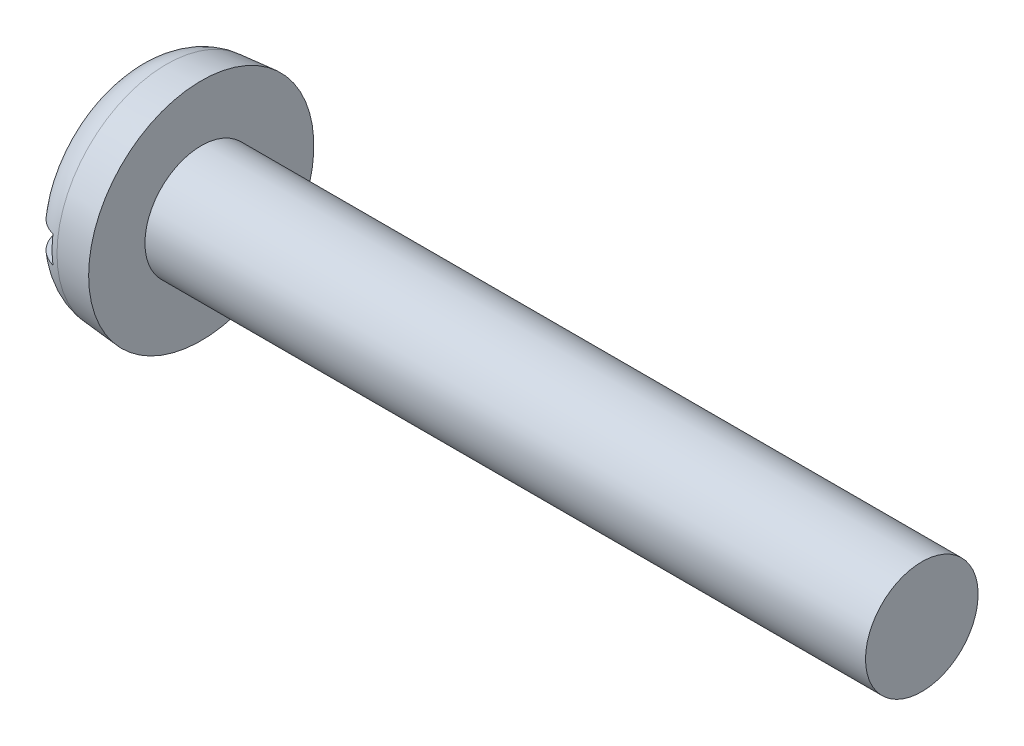
ISO-10303-21;
HEADER;
FILE_DESCRIPTION(('STEP AP214'),'2;1');
FILE_NAME('part.step','',(''),(''),'','','');
FILE_SCHEMA(('AUTOMOTIVE_DESIGN { 1 0 10303 214 1 1 1 1 }'));
ENDSEC;
DATA;
#1=APPLICATION_CONTEXT('core data for automotive mechanical design processes');
#2=APPLICATION_PROTOCOL_DEFINITION('international standard','automotive_design',2000,#1);
#3=PRODUCT_CONTEXT('',#1,'mechanical');
#4=PRODUCT('Part','Part','',(#3));
#5=PRODUCT_RELATED_PRODUCT_CATEGORY('part','',(#4));
#6=PRODUCT_DEFINITION_FORMATION('','',#4);
#7=PRODUCT_DEFINITION_CONTEXT('part definition',#1,'design');
#8=PRODUCT_DEFINITION('design','',#6,#7);
#9=PRODUCT_DEFINITION_SHAPE('','',#8);
#10=(LENGTH_UNIT() NAMED_UNIT(*) SI_UNIT(.MILLI.,.METRE.));
#11=(NAMED_UNIT(*) PLANE_ANGLE_UNIT() SI_UNIT($,.RADIAN.));
#12=(NAMED_UNIT(*) SI_UNIT($,.STERADIAN.) SOLID_ANGLE_UNIT());
#13=UNCERTAINTY_MEASURE_WITH_UNIT(LENGTH_MEASURE(1.E-05),#10,'distance_accuracy_value','');
#14=(GEOMETRIC_REPRESENTATION_CONTEXT(3) GLOBAL_UNCERTAINTY_ASSIGNED_CONTEXT((#13)) GLOBAL_UNIT_ASSIGNED_CONTEXT((#10,
#11,#12)) REPRESENTATION_CONTEXT('',''));
#15=CARTESIAN_POINT('',(0.,0.,0.));
#16=DIRECTION('',(0.,0.,1.));
#17=DIRECTION('',(1.,0.,0.));
#18=AXIS2_PLACEMENT_3D('',#15,#16,#17);
#19=CARTESIAN_POINT('',(0.,0.,0.));
#20=DIRECTION('',(-1.,0.,0.));
#21=DIRECTION('',(0.,0.,1.));
#22=AXIS2_PLACEMENT_3D('',#19,#20,#21);
#23=PLANE('',#22);
#24=DIRECTION('',(0.,0.,-1.));
#25=VECTOR('',#24,1.);
#26=CARTESIAN_POINT('',(0.,0.3,2.5));
#27=LINE('',#26,#25);
#28=CARTESIAN_POINT('',(0.,0.3,1.60795561103898));
#29=VERTEX_POINT('',#28);
#30=CARTESIAN_POINT('',(0.,0.3,-1.60795561103898));
#31=VERTEX_POINT('',#30);
#32=EDGE_CURVE('E92',#29,#31,#27,.T.);
#33=ORIENTED_EDGE('',*,*,#32,.F.);
#34=CARTESIAN_POINT('',(0.,0.,0.));
#35=DIRECTION('',(-1.,0.,0.));
#36=DIRECTION('',(0.,0.,1.));
#37=AXIS2_PLACEMENT_3D('',#34,#35,#36);
#38=CIRCLE('',#37,1.63570206549718);
#39=EDGE_CURVE('E97',#29,#31,#38,.T.);
#40=ORIENTED_EDGE('',*,*,#39,.T.);
#41=EDGE_LOOP('',(#33,#40));
#42=FACE_BOUND('',#41,.T.);
#43=ADVANCED_FACE('F35',(#42),#23,.T.);
#44=CARTESIAN_POINT('',(-25.4,0.,0.));
#45=DIRECTION('',(-1.,0.,0.));
#46=DIRECTION('',(0.,0.,1.));
#47=AXIS2_PLACEMENT_3D('',#44,#45,#46);
#48=CYLINDRICAL_SURFACE('',#47,1.25);
#49=CARTESIAN_POINT('',(17.5,0.,0.));
#50=DIRECTION('',(-1.,0.,0.));
#51=DIRECTION('',(0.,0.,1.));
#52=AXIS2_PLACEMENT_3D('',#49,#50,#51);
#53=CIRCLE('',#52,1.25);
#54=CARTESIAN_POINT('',(17.5,0.,1.25));
#55=VERTEX_POINT('',#54);
#56=EDGE_CURVE('E98',#55,#55,#53,.T.);
#57=ORIENTED_EDGE('',*,*,#56,.T.);
#58=EDGE_LOOP('',(#57));
#59=FACE_BOUND('',#58,.T.);
#60=CARTESIAN_POINT('',(1.5,0.,0.));
#61=DIRECTION('',(-1.,0.,0.));
#62=DIRECTION('',(0.,0.,1.));
#63=AXIS2_PLACEMENT_3D('',#60,#61,#62);
#64=CIRCLE('',#63,1.25);
#65=CARTESIAN_POINT('',(1.5,0.,1.25));
#66=VERTEX_POINT('',#65);
#67=EDGE_CURVE('E130',#66,#66,#64,.T.);
#68=ORIENTED_EDGE('',*,*,#67,.F.);
#69=EDGE_LOOP('',(#68));
#70=FACE_BOUND('',#69,.T.);
#71=ADVANCED_FACE('F147',(#59,#70),#48,.T.);
#72=CARTESIAN_POINT('',(17.5,1.25,0.));
#73=DIRECTION('',(1.,0.,0.));
#74=DIRECTION('',(0.,0.,-1.));
#75=AXIS2_PLACEMENT_3D('',#72,#73,#74);
#76=PLANE('',#75);
#77=ORIENTED_EDGE('',*,*,#56,.F.);
#78=EDGE_LOOP('',(#77));
#79=FACE_BOUND('',#78,.T.);
#80=ADVANCED_FACE('F149',(#79),#76,.T.);
#81=DIRECTION('',(0.,0.,1.));
#82=VECTOR('',#81,1.);
#83=CARTESIAN_POINT('',(0.,-0.3,-2.5));
#84=LINE('',#83,#82);
#85=CARTESIAN_POINT('',(0.,-0.3,-1.60795561103898));
#86=VERTEX_POINT('',#85);
#87=CARTESIAN_POINT('',(0.,-0.3,1.60795561103898));
#88=VERTEX_POINT('',#87);
#89=EDGE_CURVE('E80',#86,#88,#84,.T.);
#90=ORIENTED_EDGE('',*,*,#89,.F.);
#91=EDGE_CURVE('E91',#86,#88,#38,.T.);
#92=ORIENTED_EDGE('',*,*,#91,.T.);
#93=EDGE_LOOP('',(#90,#92));
#94=FACE_BOUND('',#93,.T.);
#95=ADVANCED_FACE('F90',(#94),#23,.T.);
#96=CARTESIAN_POINT('',(0.,0.,0.));
#97=DIRECTION('',(1.,0.,0.));
#98=DIRECTION('',(0.,0.,-1.));
#99=AXIS2_PLACEMENT_3D('',#96,#97,#98);
#100=CONICAL_SURFACE('',#99,2.36876700471111,0.0872664625997166);
#101=CARTESIAN_POINT('',(0.730275405801877,0.,0.));
#102=DIRECTION('',(-1.,0.,0.));
#103=DIRECTION('',(0.,0.,1.));
#104=AXIS2_PLACEMENT_3D('',#101,#102,#103);
#105=CIRCLE('',#104,2.43265782397057);
#106=CARTESIAN_POINT('',(0.730275405801877,0.,2.43265782397057));
#107=VERTEX_POINT('',#106);
#108=EDGE_CURVE('E101',#107,#107,#105,.F.);
#109=ORIENTED_EDGE('',*,*,#108,.T.);
#110=EDGE_LOOP('',(#109));
#111=FACE_BOUND('',#110,.T.);
#112=CARTESIAN_POINT('',(1.5,0.,0.));
#113=DIRECTION('',(-1.,0.,0.));
#114=DIRECTION('',(0.,0.,1.));
#115=AXIS2_PLACEMENT_3D('',#112,#113,#114);
#116=CIRCLE('',#115,2.5);
#117=CARTESIAN_POINT('',(1.5,0.,2.5));
#118=VERTEX_POINT('',#117);
#119=EDGE_CURVE('E103',#118,#118,#116,.T.);
#120=ORIENTED_EDGE('',*,*,#119,.T.);
#121=EDGE_LOOP('',(#120));
#122=FACE_BOUND('',#121,.T.);
#123=ADVANCED_FACE('F140',(#111,#122),#100,.T.);
#124=CARTESIAN_POINT('',(1.5,1.25,0.));
#125=DIRECTION('',(-1.,0.,0.));
#126=DIRECTION('',(0.,0.,1.));
#127=AXIS2_PLACEMENT_3D('',#124,#125,#126);
#128=PLANE('',#127);
#129=ORIENTED_EDGE('',*,*,#119,.F.);
#130=EDGE_LOOP('',(#129));
#131=FACE_BOUND('',#130,.T.);
#132=ORIENTED_EDGE('',*,*,#67,.T.);
#133=EDGE_LOOP('',(#132));
#134=FACE_BOUND('',#133,.T.);
#135=ADVANCED_FACE('F142',(#131,#134),#128,.F.);
#136=CARTESIAN_POINT('',(0.8,0.,0.));
#137=DIRECTION('',(-1.,0.,0.));
#138=DIRECTION('',(0.,0.,1.));
#139=AXIS2_PLACEMENT_3D('',#136,#137,#138);
#140=TOROIDAL_SURFACE('',#139,1.63570206549718,0.8);
#141=CARTESIAN_POINT('',(0.325582780276124,0.3,0.945080375473809));
#142=CARTESIAN_POINT('',(0.360465980063241,0.3,0.918126802110936));
#143=CARTESIAN_POINT('',(0.39753706526557,0.3,0.893967942779769));
#144=CARTESIAN_POINT('',(0.475178290688802,0.3,0.852069987659488));
#145=CARTESIAN_POINT('',(0.515750532052562,0.3,0.834334780531919));
#146=CARTESIAN_POINT('',(0.599430848847029,0.3,0.806000384113138));
#147=CARTESIAN_POINT('',(0.642544269111198,0.3,0.795416864771676));
#148=CARTESIAN_POINT('',(0.729949162731264,0.3,0.781986474876278));
#149=CARTESIAN_POINT('',(0.774240066404735,0.3,0.779135929395147));
#150=CARTESIAN_POINT('',(0.860900121676645,0.3,0.781273956549656));
#151=CARTESIAN_POINT('',(0.903277030490993,0.3,0.78596201346097));
#152=CARTESIAN_POINT('',(0.986642370355979,0.3,0.802380024886476));
#153=CARTESIAN_POINT('',(1.02763059365552,0.3,0.814111028173032));
#154=CARTESIAN_POINT('',(1.10721823284323,0.3,0.844123858953993));
#155=CARTESIAN_POINT('',(1.1458124991436,0.3,0.862419270395216));
#156=CARTESIAN_POINT('',(1.21961995450231,0.3,0.904880158503461));
#157=CARTESIAN_POINT('',(1.25483237249778,0.3,0.929046969439742));
#158=CARTESIAN_POINT('',(1.32303560057829,0.3,0.984072001853194));
#159=CARTESIAN_POINT('',(1.35577888139986,0.3,1.01523716445421));
#160=CARTESIAN_POINT('',(1.41584692891579,0.3,1.08241378648038));
#161=CARTESIAN_POINT('',(1.44317052446759,0.3,1.11842629055405));
#162=CARTESIAN_POINT('',(1.49280325678613,0.3,1.19602852166851));
#163=CARTESIAN_POINT('',(1.51483781340697,0.3,1.23779426477491));
#164=CARTESIAN_POINT('',(1.55163905141108,0.3,1.32441622243948));
#165=CARTESIAN_POINT('',(1.56640526316449,0.3,1.36927263648188));
#166=CARTESIAN_POINT('',(1.58827918347229,0.3,1.46113964054829));
#167=CARTESIAN_POINT('',(1.59533472667039,0.3,1.50816268758402));
#168=CARTESIAN_POINT('',(1.6013346905055,0.3,1.60272526959095));
#169=CARTESIAN_POINT('',(1.60027956409726,0.3,1.65026477557152));
#170=CARTESIAN_POINT('',(1.59008797685701,0.3,1.74381783348114));
#171=CARTESIAN_POINT('',(1.58106139766669,0.3,1.78984333913577));
#172=CARTESIAN_POINT('',(1.55527524427561,0.3,1.87967577306516));
#173=CARTESIAN_POINT('',(1.53851634881931,0.3,1.92348289569559));
#174=CARTESIAN_POINT('',(1.49805220541173,0.3,2.00685269808732));
#175=CARTESIAN_POINT('',(1.47446834364961,0.3,2.04647430465032));
#176=CARTESIAN_POINT('',(1.42089792894649,0.3,2.1211234970726));
#177=CARTESIAN_POINT('',(1.3909118606683,0.3,2.15615143036044));
#178=CARTESIAN_POINT('',(1.32582862648853,0.3,2.2201279422891));
#179=CARTESIAN_POINT('',(1.29080536334854,0.3,2.24915172052564));
#180=CARTESIAN_POINT('',(1.21634648807777,0.3,2.30084404424662));
#181=CARTESIAN_POINT('',(1.17691110751969,0.3,2.32351292305314));
#182=CARTESIAN_POINT('',(1.09512866163486,0.3,2.36164850031485));
#183=CARTESIAN_POINT('',(1.05281068319476,0.3,2.3771775951495));
#184=CARTESIAN_POINT('',(0.966161216102551,0.3,2.40087211912405));
#185=CARTESIAN_POINT('',(0.921829790458232,0.3,2.40903777852502));
#186=CARTESIAN_POINT('',(0.832640430359507,0.3,2.41774335624929));
#187=CARTESIAN_POINT('',(0.7877860528966,0.3,2.41831975618198));
#188=CARTESIAN_POINT('',(0.698619111765284,0.3,2.41192430101879));
#189=CARTESIAN_POINT('',(0.654306541311374,0.3,2.40495254055294));
#190=CARTESIAN_POINT('',(0.567532539437919,0.3,2.38367749197694));
#191=CARTESIAN_POINT('',(0.52506904210772,0.3,2.36938262630023));
#192=CARTESIAN_POINT('',(0.443136883800956,0.3,2.33388299490975));
#193=CARTESIAN_POINT('',(0.403668232188874,0.3,2.31267820759068));
#194=CARTESIAN_POINT('',(0.328740033099907,0.3,2.26391578070522));
#195=CARTESIAN_POINT('',(0.293290208870805,0.3,2.2363432040147));
#196=CARTESIAN_POINT('',(0.227488732055977,0.3,2.17567064913893));
#197=CARTESIAN_POINT('',(0.197137190224435,0.3,2.14257055090592));
#198=CARTESIAN_POINT('',(0.142187319315971,0.3,2.07157434399725));
#199=CARTESIAN_POINT('',(0.117625116072336,0.3,2.03365028172316));
#200=CARTESIAN_POINT('',(0.0751433334566951,0.3,1.95424980482485));
#201=CARTESIAN_POINT('',(0.0572240456172602,0.3,1.91277323439274));
#202=CARTESIAN_POINT('',(0.0283296075078316,0.3,1.82699572686938));
#203=CARTESIAN_POINT('',(0.0174274062366743,0.3,1.78267022764793));
#204=CARTESIAN_POINT('',(0.00310551600841476,0.3,1.69282988983353));
#205=CARTESIAN_POINT('',(-0.000313975803850485,0.3,1.64731501993655));
#206=CARTESIAN_POINT('',(0.000364158464117038,0.3,1.55568808107934));
#207=CARTESIAN_POINT('',(0.00457053083061458,0.3,1.50957683083959));
#208=CARTESIAN_POINT('',(0.020533993522222,0.3,1.41866966757813));
#209=CARTESIAN_POINT('',(0.0322934645206838,0.3,1.37387417392873));
#210=CARTESIAN_POINT('',(0.0632540980285071,0.3,1.2860673502027));
#211=CARTESIAN_POINT('',(0.082579900046769,0.3,1.24310001738617));
#212=CARTESIAN_POINT('',(0.128084294551766,0.3,1.16099749323879));
#213=CARTESIAN_POINT('',(0.154256710810677,0.3,1.12185889156622));
#214=CARTESIAN_POINT('',(0.204267252853677,0.3,1.05910852071675));
#215=CARTESIAN_POINT('',(0.226595353173644,0.3,1.03427766528722));
#216=CARTESIAN_POINT('',(0.274059220486001,0.3,0.987458240525279));
#217=CARTESIAN_POINT('',(0.299195010489983,0.3,0.965469694491385));
#218=CARTESIAN_POINT('',(0.325582780276124,0.3,0.945080375473809));
#219=B_SPLINE_CURVE_WITH_KNOTS('',3,(#141,#142,#143,#144,#145,#146,#147,#148,#149,#150,#151,
#152,#153,#154,#155,#156,#157,#158,#159,#160,#161,#162,#163,#164,#165,#166,#167,#168,#169,#170,
#171,#172,#173,#174,#175,#176,#177,#178,#179,#180,#181,#182,#183,#184,#185,#186,#187,#188,#189,
#190,#191,#192,#193,#194,#195,#196,#197,#198,#199,#200,#201,#202,#203,#204,#205,#206,#207,#208,
#209,#210,#211,#212,#213,#214,#215,#216,#217,#218),.UNSPECIFIED.,.T.,.F.,(4,2,2,2,2,2,2,2,2,2,2,
2,2,2,2,2,2,2,2,2,2,2,2,2,2,2,2,2,2,2,2,2,2,2,2,2,2,2,4),(0.,0.132137862657641,
0.264355583932757,0.396862074070834,0.529305582348701,0.656598994130806,0.783911366008512,
0.911488723559627,1.03909510009137,1.17410712621123,1.30914829544115,1.45015029628925,
1.59116140650979,1.73312071075873,1.87507208709587,2.01509676952345,2.15510916289082,
2.29277014164694,2.43042070282039,2.56622605401732,2.70202428072775,2.83661205399818,
2.97119561844513,3.10513200149609,3.23906670542823,3.37284771335673,3.50662913958331,
3.64072762713688,3.77482902744559,3.90974629679403,4.04466948645321,4.18097358933906,
4.31728128334746,4.45554806235823,4.59385844329857,4.73455014764674,4.87511537117283,
4.97507165217749,5.07502875247568),.UNSPECIFIED.);
#220=CARTESIAN_POINT('',(0.6,0.3,2.39155597690766));
#221=VERTEX_POINT('',#220);
#222=EDGE_CURVE('E11',#221,#29,#219,.T.);
#223=ORIENTED_EDGE('',*,*,#222,.F.);
#224=CARTESIAN_POINT('',(0.6,0.,0.));
#225=DIRECTION('',(1.,0.,0.));
#226=DIRECTION('',(0.,0.,-1.));
#227=AXIS2_PLACEMENT_3D('',#224,#225,#226);
#228=CIRCLE('',#227,2.41029873473866);
#229=CARTESIAN_POINT('',(0.6,-0.3,2.39155597690766));
#230=VERTEX_POINT('',#229);
#231=EDGE_CURVE('E109',#230,#221,#228,.F.);
#232=ORIENTED_EDGE('',*,*,#231,.F.);
#233=CARTESIAN_POINT('',(0.325582780276124,-0.3,0.945080375473809));
#234=CARTESIAN_POINT('',(0.288319872699061,-0.3,0.973876239840002));
#235=CARTESIAN_POINT('',(0.253501025497472,-0.3,1.00590457011677));
#236=CARTESIAN_POINT('',(0.189696105139144,-0.3,1.07538681117859));
#237=CARTESIAN_POINT('',(0.160720268948851,-0.3,1.11285004990448));
#238=CARTESIAN_POINT('',(0.109449771941156,-0.3,1.19204724103533));
#239=CARTESIAN_POINT('',(0.0871478980859334,-0.3,1.23377651688002));
#240=CARTESIAN_POINT('',(0.0498324656753436,-0.3,1.32035492082811));
#241=CARTESIAN_POINT('',(0.0348158474429036,-0.3,1.36520273013943));
#242=CARTESIAN_POINT('',(0.0124672870341865,-0.3,1.45703060525634));
#243=CARTESIAN_POINT('',(0.00517650149456261,-0.3,1.5040207135215));
#244=CARTESIAN_POINT('',(-0.00129803052623053,-0.3,1.59856214347722));
#245=CARTESIAN_POINT('',(-0.000481538957046699,-0.3,1.64611348160597));
#246=CARTESIAN_POINT('',(0.00924123711837011,-0.3,1.73973571765257));
#247=CARTESIAN_POINT('',(0.0180384259755174,-0.3,1.78581792880115));
#248=CARTESIAN_POINT('',(0.0433789474329805,-0.3,1.87580166041041));
#249=CARTESIAN_POINT('',(0.0599215274474679,-0.3,1.91970339228043));
#250=CARTESIAN_POINT('',(0.0999760543041025,-0.3,2.00329545662408));
#251=CARTESIAN_POINT('',(0.123366167469034,-0.3,2.04304417862551));
#252=CARTESIAN_POINT('',(0.17657394694873,-0.3,2.11797834247722));
#253=CARTESIAN_POINT('',(0.206391116793018,-0.3,2.15316413646367));
#254=CARTESIAN_POINT('',(0.271166531540861,-0.3,2.21747794151493));
#255=CARTESIAN_POINT('',(0.306050118783759,-0.3,2.24668116447447));
#256=CARTESIAN_POINT('',(0.380262387001055,-0.3,2.29875303790471));
#257=CARTESIAN_POINT('',(0.419590838775216,-0.3,2.32162201479229));
#258=CARTESIAN_POINT('',(0.50119340100906,-0.3,2.36016923909351));
#259=CARTESIAN_POINT('',(0.543437895029165,-0.3,2.37591020202877));
#260=CARTESIAN_POINT('',(0.62997726870514,-0.3,2.40003737008239));
#261=CARTESIAN_POINT('',(0.674272082666228,-0.3,2.40842381067724));
#262=CARTESIAN_POINT('',(0.763423623490876,-0.3,2.41757198417444));
#263=CARTESIAN_POINT('',(0.808276568401031,-0.3,2.41837061178104));
#264=CARTESIAN_POINT('',(0.897477959857987,-0.3,2.412416280748));
#265=CARTESIAN_POINT('',(0.941826412901448,-0.3,2.4056634194651));
#266=CARTESIAN_POINT('',(1.02870592579272,-0.3,2.38481675397559));
#267=CARTESIAN_POINT('',(1.07123910185823,-0.3,2.3707317652175));
#268=CARTESIAN_POINT('',(1.15334462336639,-0.3,2.33563687427536));
#269=CARTESIAN_POINT('',(1.19291695839926,-0.3,2.3146269477459));
#270=CARTESIAN_POINT('',(1.26808156834652,-0.3,2.26623538653595));
#271=CARTESIAN_POINT('',(1.30366440537132,-0.3,2.23883909590375));
#272=CARTESIAN_POINT('',(1.36975910078969,-0.3,2.17849415724029));
#273=CARTESIAN_POINT('',(1.40027085417096,-0.3,2.14554539425655));
#274=CARTESIAN_POINT('',(1.45556302611409,-0.3,2.07482553439457));
#275=CARTESIAN_POINT('',(1.48030778011452,-0.3,2.0370265603882));
#276=CARTESIAN_POINT('',(1.52317234997849,-0.3,1.95784414638022));
#277=CARTESIAN_POINT('',(1.54129190452178,-0.3,1.91646056506921));
#278=CARTESIAN_POINT('',(1.570599696159,-0.3,1.83083876389679));
#279=CARTESIAN_POINT('',(1.58171568822742,-0.3,1.7865758258756));
#280=CARTESIAN_POINT('',(1.59647258253787,-0.3,1.69682261824247));
#281=CARTESIAN_POINT('',(1.60011299246853,-0.3,1.65133226799804));
#282=CARTESIAN_POINT('',(1.59987999489482,-0.3,1.55971607601715));
#283=CARTESIAN_POINT('',(1.59589756237402,-0.3,1.51359052238826));
#284=CARTESIAN_POINT('',(1.58037822497845,-0.3,1.4226292271058));
#285=CARTESIAN_POINT('',(1.56884064187058,-0.3,1.37779360162759));
#286=CARTESIAN_POINT('',(1.53832268497704,-0.3,1.28988447452704));
#287=CARTESIAN_POINT('',(1.51922047869228,-0.3,1.24685325415186));
#288=CARTESIAN_POINT('',(1.47414116635523,-0.3,1.1645512163136));
#289=CARTESIAN_POINT('',(1.44816311794703,-0.3,1.12528091530186));
#290=CARTESIAN_POINT('',(1.38971753110438,-0.3,1.05120370088367));
#291=CARTESIAN_POINT('',(1.35718249294124,-0.3,1.01644997009827));
#292=CARTESIAN_POINT('',(1.28665802197112,-0.3,0.952985855961011));
#293=CARTESIAN_POINT('',(1.24866833271037,-0.3,0.924275756910813));
#294=CARTESIAN_POINT('',(1.16886658351891,-0.3,0.874321736845592));
#295=CARTESIAN_POINT('',(1.12712266496231,-0.3,0.852969293491693));
#296=CARTESIAN_POINT('',(1.04050129775811,-0.3,0.818052122597549));
#297=CARTESIAN_POINT('',(0.995625742846647,-0.3,0.804482733551837));
#298=CARTESIAN_POINT('',(0.906698289518631,-0.3,0.786354080290169));
#299=CARTESIAN_POINT('',(0.862740322113912,-0.3,0.781334006374621));
#300=CARTESIAN_POINT('',(0.774621082919509,-0.3,0.779130773652538));
#301=CARTESIAN_POINT('',(0.730459811566579,-0.3,0.781947598017948));
#302=CARTESIAN_POINT('',(0.645236375145286,-0.3,0.794965868177597));
#303=CARTESIAN_POINT('',(0.604123123718093,-0.3,0.804839124022906));
#304=CARTESIAN_POINT('',(0.524093538910992,-0.3,0.831147245892212));
#305=CARTESIAN_POINT('',(0.485174980968056,-0.3,0.847575326297068));
#306=CARTESIAN_POINT('',(0.426325488775994,-0.3,0.878103792856924));
#307=CARTESIAN_POINT('',(0.40534570724319,-0.3,0.890233375641511));
#308=CARTESIAN_POINT('',(0.364556116612417,-0.3,0.916317187598281));
#309=CARTESIAN_POINT('',(0.344746244612206,-0.3,0.930271318540531));
#310=CARTESIAN_POINT('',(0.325582780276124,-0.3,0.945080375473809));
#311=B_SPLINE_CURVE_WITH_KNOTS('',3,(#233,#234,#235,#236,#237,#238,#239,#240,#241,#242,#243,
#244,#245,#246,#247,#248,#249,#250,#251,#252,#253,#254,#255,#256,#257,#258,#259,#260,#261,#262,
#263,#264,#265,#266,#267,#268,#269,#270,#271,#272,#273,#274,#275,#276,#277,#278,#279,#280,#281,
#282,#283,#284,#285,#286,#287,#288,#289,#290,#291,#292,#293,#294,#295,#296,#297,#298,#299,#300,
#301,#302,#303,#304,#305,#306,#307,#308,#309,#310),.UNSPECIFIED.,.T.,.F.,(4,2,2,2,2,2,2,2,2,2,2,
2,2,2,2,2,2,2,2,2,2,2,2,2,2,2,2,2,2,2,2,2,2,2,2,2,2,2,4),(0.,0.141187565020555,
0.282620381937867,0.423899785415419,0.565119802594269,0.707088394549105,0.849061155076562,
0.989121927682423,1.12916909401811,1.26686199150291,1.40454425644173,1.54037200321891,
1.67619274920678,1.81079408663139,1.94539111424423,2.07933334527763,2.21327384949565,
2.34705368713703,2.48083399510192,2.61492438921415,2.74901755973232,2.88391920604953,
3.01882617276995,3.1551029152399,3.29138863205288,3.4296381362999,3.5679000530393,
3.70848574952963,3.84909072372056,3.99122474935159,4.13336545969056,4.27330959781958,
4.41316983143447,4.54522036072568,4.67727060646696,4.80354847872817,4.92969596465089,
5.00230942015068,5.07491896789932),.UNSPECIFIED.);
#312=EDGE_CURVE('E47',#88,#230,#311,.T.);
#313=ORIENTED_EDGE('',*,*,#312,.F.);
#314=ORIENTED_EDGE('',*,*,#91,.F.);
#315=CARTESIAN_POINT('',(0.241553058720998,-0.3,-2.18806414405227));
#316=CARTESIAN_POINT('',(0.20919394733407,-0.3,-2.15621947925941));
#317=CARTESIAN_POINT('',(0.179521285352849,-0.3,-2.12159379696879));
#318=CARTESIAN_POINT('',(0.126408757548875,-0.3,-2.0478077979506));
#319=CARTESIAN_POINT('',(0.102977245311463,-0.3,-2.00864150332961));
#320=CARTESIAN_POINT('',(0.0630267203183275,-0.3,-1.92697599989271));
#321=CARTESIAN_POINT('',(0.0465007926937618,-0.3,-1.88448017597736));
#322=CARTESIAN_POINT('',(0.02074817980991,-0.3,-1.79734823209289));
#323=CARTESIAN_POINT('',(0.0115196570636036,-0.3,-1.75271265391829));
#324=CARTESIAN_POINT('',(0.000494973740622028,-0.3,-1.66209112462356));
#325=CARTESIAN_POINT('',(-0.00122761679602517,-0.3,-1.61609623625009));
#326=CARTESIAN_POINT('',(0.00294230518799017,-0.3,-1.52445227121372));
#327=CARTESIAN_POINT('',(0.00883576053178596,-0.3,-1.47880323806946));
#328=CARTESIAN_POINT('',(0.0281740434842041,-0.3,-1.38835001190999));
#329=CARTESIAN_POINT('',(0.0417411865632999,-0.3,-1.34357197052365));
#330=CARTESIAN_POINT('',(0.0760891476059405,-0.3,-1.25687228898699));
#331=CARTESIAN_POINT('',(0.0968707552683915,-0.3,-1.21495096213527));
#332=CARTESIAN_POINT('',(0.145417771230191,-0.3,-1.13451591660961));
#333=CARTESIAN_POINT('',(0.173281727359745,-0.3,-1.09606162300239));
#334=CARTESIAN_POINT('',(0.23508474050415,-0.3,-1.02437648001458));
#335=CARTESIAN_POINT('',(0.269024637887109,-0.3,-0.991146354388286));
#336=CARTESIAN_POINT('',(0.341995853853352,-0.3,-0.931047132162467));
#337=CARTESIAN_POINT('',(0.381013644461443,-0.3,-0.904161650056413));
#338=CARTESIAN_POINT('',(0.463164816939515,-0.3,-0.857652399196355));
#339=CARTESIAN_POINT('',(0.506296804132646,-0.3,-0.838026180542194));
#340=CARTESIAN_POINT('',(0.593534442378663,-0.3,-0.807594475136621));
#341=CARTESIAN_POINT('',(0.637521966771614,-0.3,-0.796451352585752));
#342=CARTESIAN_POINT('',(0.726774555121991,-0.3,-0.78223490312186));
#343=CARTESIAN_POINT('',(0.77203895038965,-0.3,-0.779157428761228));
#344=CARTESIAN_POINT('',(0.859707569111717,-0.3,-0.781175112123764));
#345=CARTESIAN_POINT('',(0.902123432161712,-0.3,-0.785800233792051));
#346=CARTESIAN_POINT('',(0.985573957329468,-0.3,-0.802105889226809));
#347=CARTESIAN_POINT('',(1.02660848299062,-0.3,-0.813787117890204));
#348=CARTESIAN_POINT('',(1.10625752636454,-0.3,-0.843701417001305));
#349=CARTESIAN_POINT('',(1.14486910075425,-0.3,-0.861942281603404));
#350=CARTESIAN_POINT('',(1.21871953983023,-0.3,-0.904297988489623));
#351=CARTESIAN_POINT('',(1.25395762277977,-0.3,-0.92841418769339));
#352=CARTESIAN_POINT('',(1.3222188205571,-0.3,-0.983337771171623));
#353=CARTESIAN_POINT('',(1.35499517386006,-0.3,-1.01445196428796));
#354=CARTESIAN_POINT('',(1.41513803816936,-0.3,-1.08153194443575));
#355=CARTESIAN_POINT('',(1.44250337212745,-0.3,-1.11749878419751));
#356=CARTESIAN_POINT('',(1.49223347077575,-0.3,-1.19501995906644));
#357=CARTESIAN_POINT('',(1.51432307210173,-0.3,-1.23675121429446));
#358=CARTESIAN_POINT('',(1.55124040522891,-0.3,-1.32331346622523));
#359=CARTESIAN_POINT('',(1.5660676697028,-0.3,-1.36814466219566));
#360=CARTESIAN_POINT('',(1.58807022940869,-0.3,-1.45997748104636));
#361=CARTESIAN_POINT('',(1.59519237591113,-0.3,-1.50699187509005));
#362=CARTESIAN_POINT('',(1.60132641837143,-0.3,-1.60154866774733));
#363=CARTESIAN_POINT('',(1.60033875857608,-0.3,-1.64909103729649));
#364=CARTESIAN_POINT('',(1.59027983202301,-0.3,-1.74266328300307));
#365=CARTESIAN_POINT('',(1.58131812921005,-0.3,-1.78870492037974));
#366=CARTESIAN_POINT('',(1.55565797967294,-0.3,-1.87858039303359));
#367=CARTESIAN_POINT('',(1.53896022163457,-0.3,-1.92241442445313));
#368=CARTESIAN_POINT('',(1.498611855126,-0.3,-2.00584729261344));
#369=CARTESIAN_POINT('',(1.4750827739187,-0.3,-2.04550491133429));
#370=CARTESIAN_POINT('',(1.42161482287186,-0.3,-2.12023491094692));
#371=CARTESIAN_POINT('',(1.39167642610132,-0.3,-2.15530762994075));
#372=CARTESIAN_POINT('',(1.32668009925899,-0.3,-2.2193797251196));
#373=CARTESIAN_POINT('',(1.29169629634944,-0.3,-2.24845431615005));
#374=CARTESIAN_POINT('',(1.21730700800494,-0.3,-2.30025414432085));
#375=CARTESIAN_POINT('',(1.17790174611446,-0.3,-2.3229797022593));
#376=CARTESIAN_POINT('',(1.09616913762727,-0.3,-2.36123223952923));
#377=CARTESIAN_POINT('',(1.05387096413483,-0.3,-2.37682157096557));
#378=CARTESIAN_POINT('',(0.967252304710148,-0.3,-2.40063821608602));
#379=CARTESIAN_POINT('',(0.92293196501786,-0.3,-2.40886606125738));
#380=CARTESIAN_POINT('',(0.833759921694475,-0.3,-2.4176963438971));
#381=CARTESIAN_POINT('',(0.788911917673141,-0.3,-2.41833619633599));
#382=CARTESIAN_POINT('',(0.699734310806114,-0.3,-2.41206700409553));
#383=CARTESIAN_POINT('',(0.655404838012143,-0.3,-2.40515610498868));
#384=CARTESIAN_POINT('',(0.568570178467568,-0.3,-2.38399597242644));
#385=CARTESIAN_POINT('',(0.526063793579498,-0.3,-2.3697516411286));
#386=CARTESIAN_POINT('',(0.444077870387186,-0.3,-2.33435117989889));
#387=CARTESIAN_POINT('',(0.404594630028166,-0.3,-2.31320367608603));
#388=CARTESIAN_POINT('',(0.344608225603683,-0.3,-2.27428784859584));
#389=CARTESIAN_POINT('',(0.322789390218973,-0.3,-2.25850723603008));
#390=CARTESIAN_POINT('',(0.280850227600135,-0.3,-2.22483136237964));
#391=CARTESIAN_POINT('',(0.260729895826327,-0.3,-2.20693610694719));
#392=CARTESIAN_POINT('',(0.241553058720998,-0.3,-2.18806414405227));
#393=B_SPLINE_CURVE_WITH_KNOTS('',3,(#315,#316,#317,#318,#319,#320,#321,#322,#323,#324,#325,
#326,#327,#328,#329,#330,#331,#332,#333,#334,#335,#336,#337,#338,#339,#340,#341,#342,#343,#344,
#345,#346,#347,#348,#349,#350,#351,#352,#353,#354,#355,#356,#357,#358,#359,#360,#361,#362,#363,
#364,#365,#366,#367,#368,#369,#370,#371,#372,#373,#374,#375,#376,#377,#378,#379,#380,#381,#382,
#383,#384,#385,#386,#387,#388,#389,#390,#391,#392),.UNSPECIFIED.,.T.,.F.,(4,2,2,2,2,2,2,2,2,2,2,
2,2,2,2,2,2,2,2,2,2,2,2,2,2,2,2,2,2,2,2,2,2,2,2,2,2,2,4),(0.,0.136101492341751,
0.272384247179854,0.408530207109711,0.544641874551918,0.682084693443672,0.819544528604169,
0.959259789886515,1.09899034929591,1.24078320813863,1.38259569363387,1.52403782880012,
1.66543218556963,1.80085275111894,1.9362036682057,2.06359377707889,2.19099643358358,
2.31855097273219,2.44613499881604,2.58111388638415,2.71612210341766,2.8571099834924,
2.99810693486668,3.1400703796344,3.28202604784365,3.42206084686375,3.56208318197957,
3.6997530188661,3.83741269789883,3.97322425828414,4.10902895526624,4.24362329439677,
4.37820791525227,4.51212864703632,4.64608227648952,4.77994647840129,4.91364404152843,
4.9943014827459,5.07495870837924),.UNSPECIFIED.);
#394=CARTESIAN_POINT('',(0.6,-0.3,-2.39155597690766));
#395=VERTEX_POINT('',#394);
#396=EDGE_CURVE('E77',#395,#86,#393,.T.);
#397=ORIENTED_EDGE('',*,*,#396,.F.);
#398=CARTESIAN_POINT('',(0.6,0.3,-2.39155597690766));
#399=VERTEX_POINT('',#398);
#400=EDGE_CURVE('E86',#399,#395,#228,.F.);
#401=ORIENTED_EDGE('',*,*,#400,.F.);
#402=CARTESIAN_POINT('',(0.241553058720998,0.3,-2.18806414405227));
#403=CARTESIAN_POINT('',(0.273486891914612,0.3,-2.219484573568));
#404=CARTESIAN_POINT('',(0.308083218056216,0.3,-2.2482435666919));
#405=CARTESIAN_POINT('',(0.381637086949644,0.3,-2.2995751686446));
#406=CARTESIAN_POINT('',(0.420599472338239,0.3,-2.32214081050004));
#407=CARTESIAN_POINT('',(0.501759436273811,0.3,-2.360393659701));
#408=CARTESIAN_POINT('',(0.543956214591295,0.3,-2.37608256202599));
#409=CARTESIAN_POINT('',(0.630379817159786,0.3,-2.40012145255148));
#410=CARTESIAN_POINT('',(0.674606157529376,0.3,-2.40847318058949));
#411=CARTESIAN_POINT('',(0.763687312295449,0.3,-2.41758391309555));
#412=CARTESIAN_POINT('',(0.808539588596342,0.3,-2.41836773919883));
#413=CARTESIAN_POINT('',(0.897738592384869,0.3,-2.41238411237289));
#414=CARTESIAN_POINT('',(0.942085308618678,0.3,-2.40561649167787));
#415=CARTESIAN_POINT('',(1.02895845869258,0.3,-2.38474089335168));
#416=CARTESIAN_POINT('',(1.07148703025055,0.3,-2.37064180790841));
#417=CARTESIAN_POINT('',(1.15358098383416,0.3,-2.33551973380574));
#418=CARTESIAN_POINT('',(1.19314635983121,0.3,-2.31449673106016));
#419=CARTESIAN_POINT('',(1.26829517137984,0.3,-2.26608024960849));
#420=CARTESIAN_POINT('',(1.30386914329185,0.3,-2.23867208560708));
#421=CARTESIAN_POINT('',(1.36994420863911,0.3,-2.17830511606258));
#422=CARTESIAN_POINT('',(1.40044520599534,0.3,-2.14534620541556));
#423=CARTESIAN_POINT('',(1.45571441925132,0.3,-2.07460780431436));
#424=CARTESIAN_POINT('',(1.48044693681306,0.3,-2.03680042922871));
#425=CARTESIAN_POINT('',(1.5232858667168,0.3,-1.95760333400944));
#426=CARTESIAN_POINT('',(1.54139201013886,0.3,-1.9162134685709));
#427=CARTESIAN_POINT('',(1.57067208837626,0.3,-1.83058118497647));
#428=CARTESIAN_POINT('',(1.58177374088685,0.3,-1.7863140623256));
#429=CARTESIAN_POINT('',(1.59650148458279,0.3,-1.69655495100336));
#430=CARTESIAN_POINT('',(1.60012708885105,0.3,-1.65106288274642));
#431=CARTESIAN_POINT('',(1.59986422485027,0.3,-1.55944552776008));
#432=CARTESIAN_POINT('',(1.59586670281559,0.3,-1.51332056475249));
#433=CARTESIAN_POINT('',(1.58031748838116,0.3,-1.42236288065648));
#434=CARTESIAN_POINT('',(1.56876510968672,0.3,-1.37753027735434));
#435=CARTESIAN_POINT('',(1.53821798132952,0.3,-1.28962965909865));
#436=CARTESIAN_POINT('',(1.51910141034678,0.3,-1.24660396598472));
#437=CARTESIAN_POINT('',(1.4739944167992,0.3,-1.16431539688196));
#438=CARTESIAN_POINT('',(1.44800306072422,0.3,-1.12505303289347));
#439=CARTESIAN_POINT('',(1.38953237038349,0.3,-1.0509944574276));
#440=CARTESIAN_POINT('',(1.35698561988225,0.3,-1.01625139889146));
#441=CARTESIAN_POINT('',(1.28643964869421,0.3,-0.952810876831012));
#442=CARTESIAN_POINT('',(1.24844019568861,0.3,-0.924113671025992));
#443=CARTESIAN_POINT('',(1.16862359990293,0.3,-0.874188722985367));
#444=CARTESIAN_POINT('',(1.12687482689383,0.3,-0.852852011374937));
#445=CARTESIAN_POINT('',(1.04024465454664,0.3,-0.817966117772457));
#446=CARTESIAN_POINT('',(0.995364998996127,0.3,-0.804412639030244));
#447=CARTESIAN_POINT('',(0.906428538947063,0.3,-0.786315179926573));
#448=CARTESIAN_POINT('',(0.862465393516494,0.3,-0.781310965763991));
#449=CARTESIAN_POINT('',(0.774351823772312,0.3,-0.779140295688705));
#450=CARTESIAN_POINT('',(0.730201454079656,0.3,-0.781971692384769));
#451=CARTESIAN_POINT('',(0.645014845758265,0.3,-0.795014505511295));
#452=CARTESIAN_POINT('',(0.603927149148142,0.3,-0.804894847866626));
#453=CARTESIAN_POINT('',(0.523912551500572,0.3,-0.831215477694099));
#454=CARTESIAN_POINT('',(0.484986067570267,0.3,-0.847657026479401));
#455=CARTESIAN_POINT('',(0.409119698217135,0.3,-0.887046273960251));
#456=CARTESIAN_POINT('',(0.372272225080267,0.3,-0.910171507729304));
#457=CARTESIAN_POINT('',(0.302689100460405,0.3,-0.961944783474812));
#458=CARTESIAN_POINT('',(0.269954439143646,0.3,-0.990594151203716));
#459=CARTESIAN_POINT('',(0.207500502676908,0.3,-1.0544791780669));
#460=CARTESIAN_POINT('',(0.178079142827188,0.3,-1.09000648969326));
#461=CARTESIAN_POINT('',(0.125406532607061,0.3,-1.16537577024847));
#462=CARTESIAN_POINT('',(0.102156346972288,0.3,-1.20521848206181));
#463=CARTESIAN_POINT('',(0.0618533969566801,0.3,-1.28940055065705));
#464=CARTESIAN_POINT('',(0.0450063043035196,0.3,-1.33383862100086));
#465=CARTESIAN_POINT('',(0.0190387255752169,0.3,-1.42491821376081));
#466=CARTESIAN_POINT('',(0.00991800152935815,0.3,-1.47155966826639));
#467=CARTESIAN_POINT('',(-0.000253787366570072,0.3,-1.56555416450616));
#468=CARTESIAN_POINT('',(-0.00133269835594806,0.3,-1.61290418134264));
#469=CARTESIAN_POINT('',(0.00461213587991566,0.3,-1.70710757215424));
#470=CARTESIAN_POINT('',(0.0116373180496951,0.3,-1.7539608565665));
#471=CARTESIAN_POINT('',(0.0334759227537505,0.3,-1.84503548093401));
#472=CARTESIAN_POINT('',(0.0481656615699059,0.3,-1.88928654661705));
#473=CARTESIAN_POINT('',(0.0848786519986773,0.3,-1.97459063767204));
#474=CARTESIAN_POINT('',(0.106892224481622,0.3,-2.01564779619323));
#475=CARTESIAN_POINT('',(0.14800411073017,0.3,-2.07862726741217));
#476=CARTESIAN_POINT('',(0.165054354520395,0.3,-2.10191210527348));
#477=CARTESIAN_POINT('',(0.201553194283454,0.3,-2.14652009119183));
#478=CARTESIAN_POINT('',(0.221001767335417,0.3,-2.16784325799319));
#479=CARTESIAN_POINT('',(0.241553058720998,0.3,-2.18806414405227));
#480=B_SPLINE_CURVE_WITH_KNOTS('',3,(#402,#403,#404,#405,#406,#407,#408,#409,#410,#411,#412,
#413,#414,#415,#416,#417,#418,#419,#420,#421,#422,#423,#424,#425,#426,#427,#428,#429,#430,#431,
#432,#433,#434,#435,#436,#437,#438,#439,#440,#441,#442,#443,#444,#445,#446,#447,#448,#449,#450,
#451,#452,#453,#454,#455,#456,#457,#458,#459,#460,#461,#462,#463,#464,#465,#466,#467,#468,#469,
#470,#471,#472,#473,#474,#475,#476,#477,#478,#479),.UNSPECIFIED.,.T.,.F.,(4,2,2,2,2,2,2,2,2,2,2,
2,2,2,2,2,2,2,2,2,2,2,2,2,2,2,2,2,2,2,2,2,2,2,2,2,2,2,4),(0.,0.134294592069905,
0.268739640223961,0.403151531688595,0.537531541939711,0.671470654671403,0.805412743104478,
0.93919275346233,1.07297303598688,1.20706409281,1.34115768894635,1.4760603227401,1.610968430717,
1.74724687330726,1.88353419146981,2.02178582366545,2.16005001659485,2.30063802859741,
2.44124514050885,2.58337977269263,2.72552046248829,2.86545608789924,3.00531438710381,
3.13737410651875,3.26939763784275,3.39559705093513,3.5218207360453,3.65176601147581,
3.78174251174178,3.91950163197518,4.05728450487463,4.19917951109284,4.34107014681232,
4.48246923292591,4.62389339450133,4.76310290581609,4.90212916479968,4.98855642366579,
5.07498285660928),.UNSPECIFIED.);
#481=EDGE_CURVE('E85',#31,#399,#480,.T.);
#482=ORIENTED_EDGE('',*,*,#481,.F.);
#483=ORIENTED_EDGE('',*,*,#39,.F.);
#484=EDGE_LOOP('',(#223,#232,#313,#314,#397,#401,#482,#483));
#485=FACE_BOUND('',#484,.T.);
#486=ORIENTED_EDGE('',*,*,#108,.F.);
#487=EDGE_LOOP('',(#486));
#488=FACE_BOUND('',#487,.T.);
#489=ADVANCED_FACE('F37',(#485,#488),#140,.T.);
#490=CARTESIAN_POINT('',(0.6,0.3,2.5));
#491=DIRECTION('',(0.,1.,0.));
#492=DIRECTION('',(0.,0.,1.));
#493=AXIS2_PLACEMENT_3D('',#490,#491,#492);
#494=PLANE('',#493);
#495=ORIENTED_EDGE('',*,*,#481,.T.);
#496=DIRECTION('',(0.,0.,-1.));
#497=VECTOR('',#496,1.);
#498=CARTESIAN_POINT('',(0.6,0.3,2.5));
#499=LINE('',#498,#497);
#500=EDGE_CURVE('E54',#221,#399,#499,.T.);
#501=ORIENTED_EDGE('',*,*,#500,.F.);
#502=ORIENTED_EDGE('',*,*,#222,.T.);
#503=ORIENTED_EDGE('',*,*,#32,.T.);
#504=EDGE_LOOP('',(#495,#501,#502,#503));
#505=FACE_BOUND('',#504,.T.);
#506=ADVANCED_FACE('F120',(#505),#494,.F.);
#507=CARTESIAN_POINT('',(0.6,-0.3,-2.5));
#508=DIRECTION('',(0.,-1.,0.));
#509=DIRECTION('',(0.,0.,-1.));
#510=AXIS2_PLACEMENT_3D('',#507,#508,#509);
#511=PLANE('',#510);
#512=ORIENTED_EDGE('',*,*,#396,.T.);
#513=ORIENTED_EDGE('',*,*,#89,.T.);
#514=ORIENTED_EDGE('',*,*,#312,.T.);
#515=DIRECTION('',(0.,0.,1.));
#516=VECTOR('',#515,1.);
#517=CARTESIAN_POINT('',(0.6,-0.3,-2.5));
#518=LINE('',#517,#516);
#519=EDGE_CURVE('E81',#395,#230,#518,.T.);
#520=ORIENTED_EDGE('',*,*,#519,.F.);
#521=EDGE_LOOP('',(#512,#513,#514,#520));
#522=FACE_BOUND('',#521,.T.);
#523=ADVANCED_FACE('F79',(#522),#511,.F.);
#524=CARTESIAN_POINT('',(0.6,-0.3,-2.5));
#525=DIRECTION('',(1.,0.,0.));
#526=DIRECTION('',(0.,0.,-1.));
#527=AXIS2_PLACEMENT_3D('',#524,#525,#526);
#528=PLANE('',#527);
#529=ORIENTED_EDGE('',*,*,#231,.T.);
#530=ORIENTED_EDGE('',*,*,#500,.T.);
#531=ORIENTED_EDGE('',*,*,#400,.T.);
#532=ORIENTED_EDGE('',*,*,#519,.T.);
#533=EDGE_LOOP('',(#529,#530,#531,#532));
#534=FACE_BOUND('',#533,.T.);
#535=ADVANCED_FACE('F119',(#534),#528,.F.);
#536=CLOSED_SHELL('',(#43,#71,#80,#95,#123,#135,#489,#506,#523,#535));
#537=MANIFOLD_SOLID_BREP('B2',#536);
#538=ADVANCED_BREP_SHAPE_REPRESENTATION('',(#18,#537),#14);
#539=SHAPE_DEFINITION_REPRESENTATION(#9,#538);
ENDSEC;
END-ISO-10303-21;
